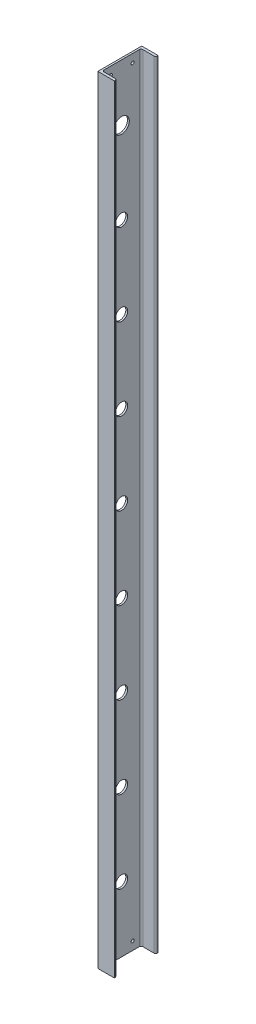
ISO-10303-21;
HEADER;
FILE_DESCRIPTION(('STEP AP214'),'2;1');
FILE_NAME('part.step','',(''),(''),'','','');
FILE_SCHEMA(('AUTOMOTIVE_DESIGN { 1 0 10303 214 1 1 1 1 }'));
ENDSEC;
DATA;
#1=APPLICATION_CONTEXT('core data for automotive mechanical design processes');
#2=APPLICATION_PROTOCOL_DEFINITION('international standard','automotive_design',2000,#1);
#3=PRODUCT_CONTEXT('',#1,'mechanical');
#4=PRODUCT('Part','Part','',(#3));
#5=PRODUCT_RELATED_PRODUCT_CATEGORY('part','',(#4));
#6=PRODUCT_DEFINITION_FORMATION('','',#4);
#7=PRODUCT_DEFINITION_CONTEXT('part definition',#1,'design');
#8=PRODUCT_DEFINITION('design','',#6,#7);
#9=PRODUCT_DEFINITION_SHAPE('','',#8);
#10=(LENGTH_UNIT() NAMED_UNIT(*) SI_UNIT(.MILLI.,.METRE.));
#11=(NAMED_UNIT(*) PLANE_ANGLE_UNIT() SI_UNIT($,.RADIAN.));
#12=(NAMED_UNIT(*) SI_UNIT($,.STERADIAN.) SOLID_ANGLE_UNIT());
#13=UNCERTAINTY_MEASURE_WITH_UNIT(LENGTH_MEASURE(1.E-05),#10,'distance_accuracy_value','');
#14=(GEOMETRIC_REPRESENTATION_CONTEXT(3) GLOBAL_UNCERTAINTY_ASSIGNED_CONTEXT((#13)) GLOBAL_UNIT_ASSIGNED_CONTEXT((#10,
#11,#12)) REPRESENTATION_CONTEXT('',''));
#15=CARTESIAN_POINT('',(0.,0.,0.));
#16=DIRECTION('',(0.,0.,1.));
#17=DIRECTION('',(1.,0.,0.));
#18=AXIS2_PLACEMENT_3D('',#15,#16,#17);
#19=CARTESIAN_POINT('',(-113.44262295082,2908.,19.0163934426229));
#20=DIRECTION('',(1.,0.,0.));
#21=DIRECTION('',(0.,0.,-1.));
#22=AXIS2_PLACEMENT_3D('',#19,#20,#21);
#23=CYLINDRICAL_SURFACE('',#22,27.5);
#24=CARTESIAN_POINT('',(-113.44262295082,2908.,19.0163934426229));
#25=DIRECTION('',(1.,0.,0.));
#26=DIRECTION('',(0.,0.,-1.));
#27=AXIS2_PLACEMENT_3D('',#24,#25,#26);
#28=CIRCLE('',#27,27.5);
#29=CARTESIAN_POINT('',(-113.44262295082,2908.,-8.48360655737707));
#30=VERTEX_POINT('',#29);
#31=EDGE_CURVE('E40',#30,#30,#28,.T.);
#32=ORIENTED_EDGE('',*,*,#31,.F.);
#33=EDGE_LOOP('',(#32));
#34=FACE_BOUND('',#33,.T.);
#35=CARTESIAN_POINT('',(-104.94262295082,2908.,19.0163934426229));
#36=DIRECTION('',(-1.,0.,0.));
#37=DIRECTION('',(0.,0.,1.));
#38=AXIS2_PLACEMENT_3D('',#35,#36,#37);
#39=CIRCLE('',#38,27.5);
#40=CARTESIAN_POINT('',(-104.94262295082,2908.,46.516393442623));
#41=VERTEX_POINT('',#40);
#42=EDGE_CURVE('E11',#41,#41,#39,.T.);
#43=ORIENTED_EDGE('',*,*,#42,.F.);
#44=EDGE_LOOP('',(#43));
#45=FACE_BOUND('',#44,.T.);
#46=ADVANCED_FACE('F32',(#34,#45),#23,.F.);
#47=CARTESIAN_POINT('',(-113.44262295082,2535.,19.0163934426229));
#48=DIRECTION('',(1.,0.,0.));
#49=DIRECTION('',(0.,0.,-1.));
#50=AXIS2_PLACEMENT_3D('',#47,#48,#49);
#51=CYLINDRICAL_SURFACE('',#50,27.5);
#52=CARTESIAN_POINT('',(-113.44262295082,2535.,19.0163934426229));
#53=DIRECTION('',(1.,0.,0.));
#54=DIRECTION('',(0.,0.,-1.));
#55=AXIS2_PLACEMENT_3D('',#52,#53,#54);
#56=CIRCLE('',#55,27.5);
#57=CARTESIAN_POINT('',(-113.44262295082,2535.,-8.48360655737707));
#58=VERTEX_POINT('',#57);
#59=EDGE_CURVE('E246',#58,#58,#56,.T.);
#60=ORIENTED_EDGE('',*,*,#59,.F.);
#61=EDGE_LOOP('',(#60));
#62=FACE_BOUND('',#61,.T.);
#63=CARTESIAN_POINT('',(-104.94262295082,2535.,19.0163934426229));
#64=DIRECTION('',(-1.,0.,0.));
#65=DIRECTION('',(0.,0.,1.));
#66=AXIS2_PLACEMENT_3D('',#63,#64,#65);
#67=CIRCLE('',#66,27.5);
#68=CARTESIAN_POINT('',(-104.94262295082,2535.,46.516393442623));
#69=VERTEX_POINT('',#68);
#70=EDGE_CURVE('E249',#69,#69,#67,.T.);
#71=ORIENTED_EDGE('',*,*,#70,.F.);
#72=EDGE_LOOP('',(#71));
#73=FACE_BOUND('',#72,.T.);
#74=ADVANCED_FACE('F258',(#62,#73),#51,.F.);
#75=CARTESIAN_POINT('',(-113.44262295082,2162.,19.0163934426229));
#76=DIRECTION('',(1.,0.,0.));
#77=DIRECTION('',(0.,0.,-1.));
#78=AXIS2_PLACEMENT_3D('',#75,#76,#77);
#79=CYLINDRICAL_SURFACE('',#78,27.5);
#80=CARTESIAN_POINT('',(-113.44262295082,2162.,19.0163934426229));
#81=DIRECTION('',(1.,0.,0.));
#82=DIRECTION('',(0.,0.,-1.));
#83=AXIS2_PLACEMENT_3D('',#80,#81,#82);
#84=CIRCLE('',#83,27.5);
#85=CARTESIAN_POINT('',(-113.44262295082,2162.,-8.48360655737707));
#86=VERTEX_POINT('',#85);
#87=EDGE_CURVE('E240',#86,#86,#84,.T.);
#88=ORIENTED_EDGE('',*,*,#87,.F.);
#89=EDGE_LOOP('',(#88));
#90=FACE_BOUND('',#89,.T.);
#91=CARTESIAN_POINT('',(-104.94262295082,2162.,19.0163934426229));
#92=DIRECTION('',(-1.,0.,0.));
#93=DIRECTION('',(0.,0.,1.));
#94=AXIS2_PLACEMENT_3D('',#91,#92,#93);
#95=CIRCLE('',#94,27.5);
#96=CARTESIAN_POINT('',(-104.94262295082,2162.,46.516393442623));
#97=VERTEX_POINT('',#96);
#98=EDGE_CURVE('E243',#97,#97,#95,.T.);
#99=ORIENTED_EDGE('',*,*,#98,.F.);
#100=EDGE_LOOP('',(#99));
#101=FACE_BOUND('',#100,.T.);
#102=ADVANCED_FACE('F314',(#90,#101),#79,.F.);
#103=CARTESIAN_POINT('',(-113.44262295082,1789.,19.0163934426229));
#104=DIRECTION('',(1.,0.,0.));
#105=DIRECTION('',(0.,0.,-1.));
#106=AXIS2_PLACEMENT_3D('',#103,#104,#105);
#107=CYLINDRICAL_SURFACE('',#106,27.5);
#108=CARTESIAN_POINT('',(-113.44262295082,1789.,19.0163934426229));
#109=DIRECTION('',(1.,0.,0.));
#110=DIRECTION('',(0.,0.,-1.));
#111=AXIS2_PLACEMENT_3D('',#108,#109,#110);
#112=CIRCLE('',#111,27.5);
#113=CARTESIAN_POINT('',(-113.44262295082,1789.,-8.48360655737707));
#114=VERTEX_POINT('',#113);
#115=EDGE_CURVE('E234',#114,#114,#112,.T.);
#116=ORIENTED_EDGE('',*,*,#115,.F.);
#117=EDGE_LOOP('',(#116));
#118=FACE_BOUND('',#117,.T.);
#119=CARTESIAN_POINT('',(-104.94262295082,1789.,19.0163934426229));
#120=DIRECTION('',(-1.,0.,0.));
#121=DIRECTION('',(0.,0.,1.));
#122=AXIS2_PLACEMENT_3D('',#119,#120,#121);
#123=CIRCLE('',#122,27.5);
#124=CARTESIAN_POINT('',(-104.94262295082,1789.,46.516393442623));
#125=VERTEX_POINT('',#124);
#126=EDGE_CURVE('E237',#125,#125,#123,.T.);
#127=ORIENTED_EDGE('',*,*,#126,.F.);
#128=EDGE_LOOP('',(#127));
#129=FACE_BOUND('',#128,.T.);
#130=ADVANCED_FACE('F310',(#118,#129),#107,.F.);
#131=CARTESIAN_POINT('',(-113.44262295082,1416.,19.0163934426229));
#132=DIRECTION('',(1.,0.,0.));
#133=DIRECTION('',(0.,0.,-1.));
#134=AXIS2_PLACEMENT_3D('',#131,#132,#133);
#135=CYLINDRICAL_SURFACE('',#134,27.5);
#136=CARTESIAN_POINT('',(-113.44262295082,1416.,19.0163934426229));
#137=DIRECTION('',(1.,0.,0.));
#138=DIRECTION('',(0.,0.,-1.));
#139=AXIS2_PLACEMENT_3D('',#136,#137,#138);
#140=CIRCLE('',#139,27.5);
#141=CARTESIAN_POINT('',(-113.44262295082,1416.,-8.48360655737707));
#142=VERTEX_POINT('',#141);
#143=EDGE_CURVE('E228',#142,#142,#140,.T.);
#144=ORIENTED_EDGE('',*,*,#143,.F.);
#145=EDGE_LOOP('',(#144));
#146=FACE_BOUND('',#145,.T.);
#147=CARTESIAN_POINT('',(-104.94262295082,1416.,19.0163934426229));
#148=DIRECTION('',(-1.,0.,0.));
#149=DIRECTION('',(0.,0.,1.));
#150=AXIS2_PLACEMENT_3D('',#147,#148,#149);
#151=CIRCLE('',#150,27.5);
#152=CARTESIAN_POINT('',(-104.94262295082,1416.,46.516393442623));
#153=VERTEX_POINT('',#152);
#154=EDGE_CURVE('E231',#153,#153,#151,.T.);
#155=ORIENTED_EDGE('',*,*,#154,.F.);
#156=EDGE_LOOP('',(#155));
#157=FACE_BOUND('',#156,.T.);
#158=ADVANCED_FACE('F306',(#146,#157),#135,.F.);
#159=CARTESIAN_POINT('',(-113.44262295082,1043.,19.0163934426229));
#160=DIRECTION('',(1.,0.,0.));
#161=DIRECTION('',(0.,0.,-1.));
#162=AXIS2_PLACEMENT_3D('',#159,#160,#161);
#163=CYLINDRICAL_SURFACE('',#162,27.5);
#164=CARTESIAN_POINT('',(-113.44262295082,1043.,19.0163934426229));
#165=DIRECTION('',(1.,0.,0.));
#166=DIRECTION('',(0.,0.,-1.));
#167=AXIS2_PLACEMENT_3D('',#164,#165,#166);
#168=CIRCLE('',#167,27.5);
#169=CARTESIAN_POINT('',(-113.44262295082,1043.,-8.48360655737707));
#170=VERTEX_POINT('',#169);
#171=EDGE_CURVE('E203',#170,#170,#168,.T.);
#172=ORIENTED_EDGE('',*,*,#171,.F.);
#173=EDGE_LOOP('',(#172));
#174=FACE_BOUND('',#173,.T.);
#175=CARTESIAN_POINT('',(-104.94262295082,1043.,19.0163934426229));
#176=DIRECTION('',(-1.,0.,0.));
#177=DIRECTION('',(0.,0.,1.));
#178=AXIS2_PLACEMENT_3D('',#175,#176,#177);
#179=CIRCLE('',#178,27.5);
#180=CARTESIAN_POINT('',(-104.94262295082,1043.,46.516393442623));
#181=VERTEX_POINT('',#180);
#182=EDGE_CURVE('E225',#181,#181,#179,.T.);
#183=ORIENTED_EDGE('',*,*,#182,.F.);
#184=EDGE_LOOP('',(#183));
#185=FACE_BOUND('',#184,.T.);
#186=ADVANCED_FACE('F302',(#174,#185),#163,.F.);
#187=CARTESIAN_POINT('',(-38.4426229508197,3540.,-80.9836065573771));
#188=DIRECTION('',(-1.,0.,0.));
#189=DIRECTION('',(0.,0.,1.));
#190=AXIS2_PLACEMENT_3D('',#187,#188,#189);
#191=PLANE('',#190);
#192=DIRECTION('',(0.,0.,-1.));
#193=VECTOR('',#192,1.);
#194=CARTESIAN_POINT('',(-38.4426229508197,0.,-80.9836065573771));
#195=LINE('',#194,#193);
#196=CARTESIAN_POINT('',(-38.4426229508197,0.,-77.4836065573772));
#197=VERTEX_POINT('',#196);
#198=CARTESIAN_POINT('',(-38.4426229508197,0.,-80.9836065573771));
#199=VERTEX_POINT('',#198);
#200=EDGE_CURVE('E153',#197,#199,#195,.T.);
#201=ORIENTED_EDGE('',*,*,#200,.T.);
#202=DIRECTION('',(0.,-1.,0.));
#203=VECTOR('',#202,1.);
#204=CARTESIAN_POINT('',(-38.4426229508197,3540.,-80.9836065573771));
#205=LINE('',#204,#203);
#206=CARTESIAN_POINT('',(-38.4426229508197,3540.,-80.9836065573771));
#207=VERTEX_POINT('',#206);
#208=EDGE_CURVE('E201',#207,#199,#205,.T.);
#209=ORIENTED_EDGE('',*,*,#208,.F.);
#210=DIRECTION('',(0.,0.,-1.));
#211=VECTOR('',#210,1.);
#212=CARTESIAN_POINT('',(-38.4426229508197,3540.,-80.9836065573771));
#213=LINE('',#212,#211);
#214=CARTESIAN_POINT('',(-38.4426229508197,3540.,-77.4836065573772));
#215=VERTEX_POINT('',#214);
#216=EDGE_CURVE('E176',#215,#207,#213,.T.);
#217=ORIENTED_EDGE('',*,*,#216,.F.);
#218=DIRECTION('',(0.,-1.,0.));
#219=VECTOR('',#218,1.);
#220=CARTESIAN_POINT('',(-38.4426229508197,3540.,-77.4836065573772));
#221=LINE('',#220,#219);
#222=EDGE_CURVE('E149',#215,#197,#221,.T.);
#223=ORIENTED_EDGE('',*,*,#222,.T.);
#224=EDGE_LOOP('',(#201,#209,#217,#223));
#225=FACE_BOUND('',#224,.T.);
#226=ADVANCED_FACE('F299',(#225),#191,.F.);
#227=CARTESIAN_POINT('',(-38.4426229508197,3540.,-80.9836065573771));
#228=DIRECTION('',(0.,0.,1.));
#229=DIRECTION('',(1.,0.,0.));
#230=AXIS2_PLACEMENT_3D('',#227,#228,#229);
#231=PLANE('',#230);
#232=DIRECTION('',(-1.,0.,0.));
#233=VECTOR('',#232,1.);
#234=CARTESIAN_POINT('',(-38.4426229508197,0.,-80.9836065573771));
#235=LINE('',#234,#233);
#236=CARTESIAN_POINT('',(-113.44262295082,0.,-80.983606557377));
#237=VERTEX_POINT('',#236);
#238=EDGE_CURVE('E156',#199,#237,#235,.T.);
#239=ORIENTED_EDGE('',*,*,#238,.T.);
#240=DIRECTION('',(0.,-1.,0.));
#241=VECTOR('',#240,1.);
#242=CARTESIAN_POINT('',(-113.44262295082,3540.,-80.983606557377));
#243=LINE('',#242,#241);
#244=CARTESIAN_POINT('',(-113.44262295082,3540.,-80.983606557377));
#245=VERTEX_POINT('',#244);
#246=EDGE_CURVE('E198',#245,#237,#243,.T.);
#247=ORIENTED_EDGE('',*,*,#246,.F.);
#248=DIRECTION('',(-1.,0.,0.));
#249=VECTOR('',#248,1.);
#250=CARTESIAN_POINT('',(-38.4426229508197,3540.,-80.9836065573771));
#251=LINE('',#250,#249);
#252=EDGE_CURVE('E104',#207,#245,#251,.T.);
#253=ORIENTED_EDGE('',*,*,#252,.F.);
#254=ORIENTED_EDGE('',*,*,#208,.T.);
#255=EDGE_LOOP('',(#239,#247,#253,#254));
#256=FACE_BOUND('',#255,.T.);
#257=ADVANCED_FACE('F295',(#256),#231,.F.);
#258=CARTESIAN_POINT('',(-113.44262295082,3540.,-80.983606557377));
#259=DIRECTION('',(1.,0.,0.));
#260=DIRECTION('',(0.,0.,-1.));
#261=AXIS2_PLACEMENT_3D('',#258,#259,#260);
#262=PLANE('',#261);
#263=CARTESIAN_POINT('',(-113.44262295082,3281.,19.0163934426229));
#264=DIRECTION('',(1.,0.,0.));
#265=DIRECTION('',(0.,0.,-1.));
#266=AXIS2_PLACEMENT_3D('',#263,#264,#265);
#267=CIRCLE('',#266,34.9999999999999);
#268=CARTESIAN_POINT('',(-113.44262295082,3281.,-15.983606557377));
#269=VERTEX_POINT('',#268);
#270=EDGE_CURVE('E514',#269,#269,#267,.T.);
#271=ORIENTED_EDGE('',*,*,#270,.T.);
#272=EDGE_LOOP('',(#271));
#273=FACE_BOUND('',#272,.T.);
#274=CARTESIAN_POINT('',(-113.44262295082,670.,19.0163934426229));
#275=DIRECTION('',(1.,0.,0.));
#276=DIRECTION('',(0.,0.,-1.));
#277=AXIS2_PLACEMENT_3D('',#274,#275,#276);
#278=CIRCLE('',#277,27.5);
#279=CARTESIAN_POINT('',(-113.44262295082,670.,-8.48360655737707));
#280=VERTEX_POINT('',#279);
#281=EDGE_CURVE('E515',#280,#280,#278,.T.);
#282=ORIENTED_EDGE('',*,*,#281,.T.);
#283=EDGE_LOOP('',(#282));
#284=FACE_BOUND('',#283,.T.);
#285=CARTESIAN_POINT('',(-113.44262295082,297.,19.0163934426229));
#286=DIRECTION('',(1.,0.,0.));
#287=DIRECTION('',(0.,0.,-1.));
#288=AXIS2_PLACEMENT_3D('',#285,#286,#287);
#289=CIRCLE('',#288,27.5);
#290=CARTESIAN_POINT('',(-113.44262295082,297.,-8.48360655737707));
#291=VERTEX_POINT('',#290);
#292=EDGE_CURVE('E222',#291,#291,#289,.T.);
#293=ORIENTED_EDGE('',*,*,#292,.T.);
#294=EDGE_LOOP('',(#293));
#295=FACE_BOUND('',#294,.T.);
#296=CARTESIAN_POINT('',(-113.44262295082,3502.5,-30.983606557377));
#297=DIRECTION('',(1.,0.,0.));
#298=DIRECTION('',(0.,0.,1.));
#299=AXIS2_PLACEMENT_3D('',#296,#297,#298);
#300=CIRCLE('',#299,7.);
#301=CARTESIAN_POINT('',(-113.44262295082,3502.5,-23.983606557377));
#302=VERTEX_POINT('',#301);
#303=EDGE_CURVE('E214',#302,#302,#300,.T.);
#304=ORIENTED_EDGE('',*,*,#303,.T.);
#305=EDGE_LOOP('',(#304));
#306=FACE_BOUND('',#305,.T.);
#307=CARTESIAN_POINT('',(-113.44262295082,3502.5,69.016393442623));
#308=DIRECTION('',(1.,0.,0.));
#309=DIRECTION('',(0.,0.,1.));
#310=AXIS2_PLACEMENT_3D('',#307,#308,#309);
#311=CIRCLE('',#310,7.5);
#312=CARTESIAN_POINT('',(-113.44262295082,3502.5,76.516393442623));
#313=VERTEX_POINT('',#312);
#314=EDGE_CURVE('E221',#313,#313,#311,.T.);
#315=ORIENTED_EDGE('',*,*,#314,.T.);
#316=EDGE_LOOP('',(#315));
#317=FACE_BOUND('',#316,.T.);
#318=CARTESIAN_POINT('',(-113.44262295082,37.5000000000001,-30.983606557377));
#319=DIRECTION('',(-1.,0.,0.));
#320=DIRECTION('',(0.,0.,1.));
#321=AXIS2_PLACEMENT_3D('',#318,#319,#320);
#322=CIRCLE('',#321,7.);
#323=CARTESIAN_POINT('',(-113.44262295082,37.5000000000001,-23.983606557377));
#324=VERTEX_POINT('',#323);
#325=EDGE_CURVE('E207',#324,#324,#322,.T.);
#326=ORIENTED_EDGE('',*,*,#325,.F.);
#327=EDGE_LOOP('',(#326));
#328=FACE_BOUND('',#327,.T.);
#329=CARTESIAN_POINT('',(-113.44262295082,37.5,69.016393442623));
#330=DIRECTION('',(-1.,0.,0.));
#331=DIRECTION('',(0.,0.,1.));
#332=AXIS2_PLACEMENT_3D('',#329,#330,#331);
#333=CIRCLE('',#332,7.5);
#334=CARTESIAN_POINT('',(-113.44262295082,37.5,76.516393442623));
#335=VERTEX_POINT('',#334);
#336=EDGE_CURVE('E217',#335,#335,#333,.T.);
#337=ORIENTED_EDGE('',*,*,#336,.F.);
#338=EDGE_LOOP('',(#337));
#339=FACE_BOUND('',#338,.T.);
#340=DIRECTION('',(0.,0.,1.));
#341=VECTOR('',#340,1.);
#342=CARTESIAN_POINT('',(-113.44262295082,0.,-80.983606557377));
#343=LINE('',#342,#341);
#344=CARTESIAN_POINT('',(-113.44262295082,0.,119.016393442623));
#345=VERTEX_POINT('',#344);
#346=EDGE_CURVE('E159',#237,#345,#343,.T.);
#347=ORIENTED_EDGE('',*,*,#346,.T.);
#348=DIRECTION('',(0.,-1.,0.));
#349=VECTOR('',#348,1.);
#350=CARTESIAN_POINT('',(-113.44262295082,3540.,119.016393442623));
#351=LINE('',#350,#349);
#352=CARTESIAN_POINT('',(-113.44262295082,3540.,119.016393442623));
#353=VERTEX_POINT('',#352);
#354=EDGE_CURVE('E195',#353,#345,#351,.T.);
#355=ORIENTED_EDGE('',*,*,#354,.F.);
#356=DIRECTION('',(0.,0.,1.));
#357=VECTOR('',#356,1.);
#358=CARTESIAN_POINT('',(-113.44262295082,3540.,-80.983606557377));
#359=LINE('',#358,#357);
#360=EDGE_CURVE('E536',#245,#353,#359,.T.);
#361=ORIENTED_EDGE('',*,*,#360,.F.);
#362=ORIENTED_EDGE('',*,*,#246,.T.);
#363=EDGE_LOOP('',(#347,#355,#361,#362));
#364=FACE_BOUND('',#363,.T.);
#365=ORIENTED_EDGE('',*,*,#171,.T.);
#366=EDGE_LOOP('',(#365));
#367=FACE_BOUND('',#366,.T.);
#368=ORIENTED_EDGE('',*,*,#143,.T.);
#369=EDGE_LOOP('',(#368));
#370=FACE_BOUND('',#369,.T.);
#371=ORIENTED_EDGE('',*,*,#115,.T.);
#372=EDGE_LOOP('',(#371));
#373=FACE_BOUND('',#372,.T.);
#374=ORIENTED_EDGE('',*,*,#87,.T.);
#375=EDGE_LOOP('',(#374));
#376=FACE_BOUND('',#375,.T.);
#377=ORIENTED_EDGE('',*,*,#59,.T.);
#378=EDGE_LOOP('',(#377));
#379=FACE_BOUND('',#378,.T.);
#380=ORIENTED_EDGE('',*,*,#31,.T.);
#381=EDGE_LOOP('',(#380));
#382=FACE_BOUND('',#381,.T.);
#383=ADVANCED_FACE('F254',(#273,#284,#295,#306,#317,#328,#339,#364,#367,#370,#373,#376,#379,
#382),#262,.F.);
#384=CARTESIAN_POINT('',(-113.44262295082,3540.,119.016393442623));
#385=DIRECTION('',(0.,0.,-1.));
#386=DIRECTION('',(-1.,0.,0.));
#387=AXIS2_PLACEMENT_3D('',#384,#385,#386);
#388=PLANE('',#387);
#389=DIRECTION('',(1.,0.,0.));
#390=VECTOR('',#389,1.);
#391=CARTESIAN_POINT('',(-113.44262295082,0.,119.016393442623));
#392=LINE('',#391,#390);
#393=CARTESIAN_POINT('',(-38.4426229508197,0.,119.016393442623));
#394=VERTEX_POINT('',#393);
#395=EDGE_CURVE('E161',#345,#394,#392,.T.);
#396=ORIENTED_EDGE('',*,*,#395,.T.);
#397=DIRECTION('',(0.,-1.,0.));
#398=VECTOR('',#397,1.);
#399=CARTESIAN_POINT('',(-38.4426229508197,3540.,119.016393442623));
#400=LINE('',#399,#398);
#401=CARTESIAN_POINT('',(-38.4426229508197,3540.,119.016393442623));
#402=VERTEX_POINT('',#401);
#403=EDGE_CURVE('E192',#402,#394,#400,.T.);
#404=ORIENTED_EDGE('',*,*,#403,.F.);
#405=DIRECTION('',(1.,0.,0.));
#406=VECTOR('',#405,1.);
#407=CARTESIAN_POINT('',(-113.44262295082,3540.,119.016393442623));
#408=LINE('',#407,#406);
#409=EDGE_CURVE('E538',#353,#402,#408,.T.);
#410=ORIENTED_EDGE('',*,*,#409,.F.);
#411=ORIENTED_EDGE('',*,*,#354,.T.);
#412=EDGE_LOOP('',(#396,#404,#410,#411));
#413=FACE_BOUND('',#412,.T.);
#414=ADVANCED_FACE('F288',(#413),#388,.F.);
#415=CARTESIAN_POINT('',(-38.4426229508197,3540.,119.016393442623));
#416=DIRECTION('',(-1.,0.,0.));
#417=DIRECTION('',(0.,0.,1.));
#418=AXIS2_PLACEMENT_3D('',#415,#416,#417);
#419=PLANE('',#418);
#420=DIRECTION('',(0.,0.,-1.));
#421=VECTOR('',#420,1.);
#422=CARTESIAN_POINT('',(-38.4426229508197,0.,119.016393442623));
#423=LINE('',#422,#421);
#424=CARTESIAN_POINT('',(-38.4426229508197,0.,115.516393442623));
#425=VERTEX_POINT('',#424);
#426=EDGE_CURVE('E163',#394,#425,#423,.T.);
#427=ORIENTED_EDGE('',*,*,#426,.T.);
#428=DIRECTION('',(0.,-1.,0.));
#429=VECTOR('',#428,1.);
#430=CARTESIAN_POINT('',(-38.4426229508197,3540.,115.516393442623));
#431=LINE('',#430,#429);
#432=CARTESIAN_POINT('',(-38.4426229508197,3540.,115.516393442623));
#433=VERTEX_POINT('',#432);
#434=EDGE_CURVE('E189',#433,#425,#431,.T.);
#435=ORIENTED_EDGE('',*,*,#434,.F.);
#436=DIRECTION('',(0.,0.,-1.));
#437=VECTOR('',#436,1.);
#438=CARTESIAN_POINT('',(-38.4426229508197,3540.,119.016393442623));
#439=LINE('',#438,#437);
#440=EDGE_CURVE('E540',#402,#433,#439,.T.);
#441=ORIENTED_EDGE('',*,*,#440,.F.);
#442=ORIENTED_EDGE('',*,*,#403,.T.);
#443=EDGE_LOOP('',(#427,#435,#441,#442));
#444=FACE_BOUND('',#443,.T.);
#445=ADVANCED_FACE('F284',(#444),#419,.F.);
#446=CARTESIAN_POINT('',(-46.4426229508197,3540.,115.516393442623));
#447=DIRECTION('',(0.,-1.,0.));
#448=DIRECTION('',(0.,0.,-1.));
#449=AXIS2_PLACEMENT_3D('',#446,#447,#448);
#450=CYLINDRICAL_SURFACE('',#449,8.);
#451=CARTESIAN_POINT('',(-46.4426229508197,0.,115.516393442623));
#452=DIRECTION('',(0.,1.,0.));
#453=DIRECTION('',(0.,0.,1.));
#454=AXIS2_PLACEMENT_3D('',#451,#452,#453);
#455=CIRCLE('',#454,8.);
#456=CARTESIAN_POINT('',(-46.4426229508198,0.,107.516393442623));
#457=VERTEX_POINT('',#456);
#458=EDGE_CURVE('E165',#425,#457,#455,.T.);
#459=ORIENTED_EDGE('',*,*,#458,.T.);
#460=DIRECTION('',(0.,-1.,0.));
#461=VECTOR('',#460,1.);
#462=CARTESIAN_POINT('',(-46.4426229508198,3540.,107.516393442623));
#463=LINE('',#462,#461);
#464=CARTESIAN_POINT('',(-46.4426229508198,3540.,107.516393442623));
#465=VERTEX_POINT('',#464);
#466=EDGE_CURVE('E186',#465,#457,#463,.T.);
#467=ORIENTED_EDGE('',*,*,#466,.F.);
#468=CARTESIAN_POINT('',(-46.4426229508197,3540.,115.516393442623));
#469=DIRECTION('',(0.,1.,0.));
#470=DIRECTION('',(0.,0.,1.));
#471=AXIS2_PLACEMENT_3D('',#468,#469,#470);
#472=CIRCLE('',#471,8.);
#473=EDGE_CURVE('E542',#433,#465,#472,.T.);
#474=ORIENTED_EDGE('',*,*,#473,.F.);
#475=ORIENTED_EDGE('',*,*,#434,.T.);
#476=EDGE_LOOP('',(#459,#467,#474,#475));
#477=FACE_BOUND('',#476,.T.);
#478=ADVANCED_FACE('F280',(#477),#450,.T.);
#479=CARTESIAN_POINT('',(-46.4426229508198,3540.,107.516393442623));
#480=DIRECTION('',(0.,0.,1.));
#481=DIRECTION('',(1.,0.,0.));
#482=AXIS2_PLACEMENT_3D('',#479,#480,#481);
#483=PLANE('',#482);
#484=DIRECTION('',(-1.,0.,0.));
#485=VECTOR('',#484,1.);
#486=CARTESIAN_POINT('',(-46.4426229508198,0.,107.516393442623));
#487=LINE('',#486,#485);
#488=CARTESIAN_POINT('',(-96.9426229508196,0.,107.516393442623));
#489=VERTEX_POINT('',#488);
#490=EDGE_CURVE('E167',#457,#489,#487,.T.);
#491=ORIENTED_EDGE('',*,*,#490,.T.);
#492=DIRECTION('',(0.,-1.,0.));
#493=VECTOR('',#492,1.);
#494=CARTESIAN_POINT('',(-96.9426229508196,3540.,107.516393442623));
#495=LINE('',#494,#493);
#496=CARTESIAN_POINT('',(-96.9426229508196,3540.,107.516393442623));
#497=VERTEX_POINT('',#496);
#498=EDGE_CURVE('E183',#497,#489,#495,.T.);
#499=ORIENTED_EDGE('',*,*,#498,.F.);
#500=DIRECTION('',(-1.,0.,0.));
#501=VECTOR('',#500,1.);
#502=CARTESIAN_POINT('',(-46.4426229508198,3540.,107.516393442623));
#503=LINE('',#502,#501);
#504=EDGE_CURVE('E544',#465,#497,#503,.T.);
#505=ORIENTED_EDGE('',*,*,#504,.F.);
#506=ORIENTED_EDGE('',*,*,#466,.T.);
#507=EDGE_LOOP('',(#491,#499,#505,#506));
#508=FACE_BOUND('',#507,.T.);
#509=ADVANCED_FACE('F271',(#508),#483,.F.);
#510=CARTESIAN_POINT('',(-96.9426229508197,3540.,99.516393442623));
#511=DIRECTION('',(0.,-1.,0.));
#512=DIRECTION('',(0.,0.,-1.));
#513=AXIS2_PLACEMENT_3D('',#510,#511,#512);
#514=CYLINDRICAL_SURFACE('',#513,8.00000000000001);
#515=CARTESIAN_POINT('',(-96.9426229508197,0.,99.516393442623));
#516=DIRECTION('',(0.,-1.,0.));
#517=DIRECTION('',(0.,0.,-1.));
#518=AXIS2_PLACEMENT_3D('',#515,#516,#517);
#519=CIRCLE('',#518,8.00000000000001);
#520=CARTESIAN_POINT('',(-104.94262295082,0.,99.5163934426229));
#521=VERTEX_POINT('',#520);
#522=EDGE_CURVE('E169',#489,#521,#519,.T.);
#523=ORIENTED_EDGE('',*,*,#522,.T.);
#524=DIRECTION('',(0.,-1.,0.));
#525=VECTOR('',#524,1.);
#526=CARTESIAN_POINT('',(-104.94262295082,3540.,99.5163934426229));
#527=LINE('',#526,#525);
#528=CARTESIAN_POINT('',(-104.94262295082,3540.,99.5163934426229));
#529=VERTEX_POINT('',#528);
#530=EDGE_CURVE('E180',#529,#521,#527,.T.);
#531=ORIENTED_EDGE('',*,*,#530,.F.);
#532=CARTESIAN_POINT('',(-96.9426229508197,3540.,99.516393442623));
#533=DIRECTION('',(0.,-1.,0.));
#534=DIRECTION('',(0.,0.,-1.));
#535=AXIS2_PLACEMENT_3D('',#532,#533,#534);
#536=CIRCLE('',#535,8.00000000000001);
#537=EDGE_CURVE('E546',#497,#529,#536,.T.);
#538=ORIENTED_EDGE('',*,*,#537,.F.);
#539=ORIENTED_EDGE('',*,*,#498,.T.);
#540=EDGE_LOOP('',(#523,#531,#538,#539));
#541=FACE_BOUND('',#540,.T.);
#542=ADVANCED_FACE('F263',(#541),#514,.F.);
#543=CARTESIAN_POINT('',(-104.94262295082,3540.,99.5163934426229));
#544=DIRECTION('',(-1.,0.,0.));
#545=DIRECTION('',(0.,0.,1.));
#546=AXIS2_PLACEMENT_3D('',#543,#544,#545);
#547=PLANE('',#546);
#548=CARTESIAN_POINT('',(-104.94262295082,3281.,19.0163934426229));
#549=DIRECTION('',(1.,0.,0.));
#550=DIRECTION('',(0.,0.,-1.));
#551=AXIS2_PLACEMENT_3D('',#548,#549,#550);
#552=CIRCLE('',#551,34.9999999999999);
#553=CARTESIAN_POINT('',(-104.94262295082,3281.,-15.983606557377));
#554=VERTEX_POINT('',#553);
#555=EDGE_CURVE('E511',#554,#554,#552,.T.);
#556=ORIENTED_EDGE('',*,*,#555,.F.);
#557=EDGE_LOOP('',(#556));
#558=FACE_BOUND('',#557,.T.);
#559=CARTESIAN_POINT('',(-104.94262295082,670.,19.0163934426229));
#560=DIRECTION('',(-1.,0.,0.));
#561=DIRECTION('',(0.,0.,1.));
#562=AXIS2_PLACEMENT_3D('',#559,#560,#561);
#563=CIRCLE('',#562,27.5);
#564=CARTESIAN_POINT('',(-104.94262295082,670.,46.516393442623));
#565=VERTEX_POINT('',#564);
#566=EDGE_CURVE('E518',#565,#565,#563,.T.);
#567=ORIENTED_EDGE('',*,*,#566,.T.);
#568=EDGE_LOOP('',(#567));
#569=FACE_BOUND('',#568,.T.);
#570=CARTESIAN_POINT('',(-104.94262295082,297.,19.0163934426229));
#571=DIRECTION('',(-1.,0.,0.));
#572=DIRECTION('',(0.,0.,1.));
#573=AXIS2_PLACEMENT_3D('',#570,#571,#572);
#574=CIRCLE('',#573,27.5);
#575=CARTESIAN_POINT('',(-104.94262295082,297.,46.516393442623));
#576=VERTEX_POINT('',#575);
#577=EDGE_CURVE('E218',#576,#576,#574,.T.);
#578=ORIENTED_EDGE('',*,*,#577,.T.);
#579=EDGE_LOOP('',(#578));
#580=FACE_BOUND('',#579,.T.);
#581=CARTESIAN_POINT('',(-104.94262295082,3502.5,-30.983606557377));
#582=DIRECTION('',(-1.,0.,0.));
#583=DIRECTION('',(0.,0.,1.));
#584=AXIS2_PLACEMENT_3D('',#581,#582,#583);
#585=CIRCLE('',#584,7.);
#586=CARTESIAN_POINT('',(-104.94262295082,3502.5,-23.983606557377));
#587=VERTEX_POINT('',#586);
#588=EDGE_CURVE('E213',#587,#587,#585,.F.);
#589=ORIENTED_EDGE('',*,*,#588,.F.);
#590=EDGE_LOOP('',(#589));
#591=FACE_BOUND('',#590,.T.);
#592=CARTESIAN_POINT('',(-104.94262295082,3502.5,69.016393442623));
#593=DIRECTION('',(-1.,0.,0.));
#594=DIRECTION('',(0.,0.,1.));
#595=AXIS2_PLACEMENT_3D('',#592,#593,#594);
#596=CIRCLE('',#595,7.5);
#597=CARTESIAN_POINT('',(-104.94262295082,3502.5,76.516393442623));
#598=VERTEX_POINT('',#597);
#599=EDGE_CURVE('E210',#598,#598,#596,.F.);
#600=ORIENTED_EDGE('',*,*,#599,.F.);
#601=EDGE_LOOP('',(#600));
#602=FACE_BOUND('',#601,.T.);
#603=CARTESIAN_POINT('',(-104.94262295082,37.5000000000001,-30.983606557377));
#604=DIRECTION('',(-1.,0.,0.));
#605=DIRECTION('',(0.,0.,1.));
#606=AXIS2_PLACEMENT_3D('',#603,#604,#605);
#607=CIRCLE('',#606,7.);
#608=CARTESIAN_POINT('',(-104.94262295082,37.5000000000001,-23.983606557377));
#609=VERTEX_POINT('',#608);
#610=EDGE_CURVE('E157',#609,#609,#607,.T.);
#611=ORIENTED_EDGE('',*,*,#610,.T.);
#612=EDGE_LOOP('',(#611));
#613=FACE_BOUND('',#612,.T.);
#614=CARTESIAN_POINT('',(-104.94262295082,37.5,69.016393442623));
#615=DIRECTION('',(-1.,0.,0.));
#616=DIRECTION('',(0.,0.,1.));
#617=AXIS2_PLACEMENT_3D('',#614,#615,#616);
#618=CIRCLE('',#617,7.5);
#619=CARTESIAN_POINT('',(-104.94262295082,37.5,76.516393442623));
#620=VERTEX_POINT('',#619);
#621=EDGE_CURVE('E204',#620,#620,#618,.T.);
#622=ORIENTED_EDGE('',*,*,#621,.T.);
#623=EDGE_LOOP('',(#622));
#624=FACE_BOUND('',#623,.T.);
#625=DIRECTION('',(0.,0.,-1.));
#626=VECTOR('',#625,1.);
#627=CARTESIAN_POINT('',(-104.94262295082,0.,99.5163934426229));
#628=LINE('',#627,#626);
#629=CARTESIAN_POINT('',(-104.94262295082,0.,-61.483606557377));
#630=VERTEX_POINT('',#629);
#631=EDGE_CURVE('E171',#521,#630,#628,.T.);
#632=ORIENTED_EDGE('',*,*,#631,.T.);
#633=DIRECTION('',(0.,-1.,0.));
#634=VECTOR('',#633,1.);
#635=CARTESIAN_POINT('',(-104.94262295082,3540.,-61.483606557377));
#636=LINE('',#635,#634);
#637=CARTESIAN_POINT('',(-104.94262295082,3540.,-61.483606557377));
#638=VERTEX_POINT('',#637);
#639=EDGE_CURVE('E144',#638,#630,#636,.T.);
#640=ORIENTED_EDGE('',*,*,#639,.F.);
#641=DIRECTION('',(0.,0.,-1.));
#642=VECTOR('',#641,1.);
#643=CARTESIAN_POINT('',(-104.94262295082,3540.,99.5163934426229));
#644=LINE('',#643,#642);
#645=EDGE_CURVE('E135',#529,#638,#644,.T.);
#646=ORIENTED_EDGE('',*,*,#645,.F.);
#647=ORIENTED_EDGE('',*,*,#530,.T.);
#648=EDGE_LOOP('',(#632,#640,#646,#647));
#649=FACE_BOUND('',#648,.T.);
#650=ORIENTED_EDGE('',*,*,#182,.T.);
#651=EDGE_LOOP('',(#650));
#652=FACE_BOUND('',#651,.T.);
#653=ORIENTED_EDGE('',*,*,#154,.T.);
#654=EDGE_LOOP('',(#653));
#655=FACE_BOUND('',#654,.T.);
#656=ORIENTED_EDGE('',*,*,#126,.T.);
#657=EDGE_LOOP('',(#656));
#658=FACE_BOUND('',#657,.T.);
#659=ORIENTED_EDGE('',*,*,#98,.T.);
#660=EDGE_LOOP('',(#659));
#661=FACE_BOUND('',#660,.T.);
#662=ORIENTED_EDGE('',*,*,#70,.T.);
#663=EDGE_LOOP('',(#662));
#664=FACE_BOUND('',#663,.T.);
#665=ORIENTED_EDGE('',*,*,#42,.T.);
#666=EDGE_LOOP('',(#665));
#667=FACE_BOUND('',#666,.T.);
#668=ADVANCED_FACE('F261',(#558,#569,#580,#591,#602,#613,#624,#649,#652,#655,#658,#661,#664,
#667),#547,.F.);
#669=CARTESIAN_POINT('',(-96.9426229508197,3540.,-61.4836065573771));
#670=DIRECTION('',(0.,-1.,0.));
#671=DIRECTION('',(0.,0.,-1.));
#672=AXIS2_PLACEMENT_3D('',#669,#670,#671);
#673=CYLINDRICAL_SURFACE('',#672,8.);
#674=CARTESIAN_POINT('',(-96.9426229508197,0.,-61.4836065573771));
#675=DIRECTION('',(0.,-1.,0.));
#676=DIRECTION('',(0.,0.,-1.));
#677=AXIS2_PLACEMENT_3D('',#674,#675,#676);
#678=CIRCLE('',#677,8.);
#679=CARTESIAN_POINT('',(-96.9426229508197,0.,-69.4836065573771));
#680=VERTEX_POINT('',#679);
#681=EDGE_CURVE('E143',#630,#680,#678,.T.);
#682=ORIENTED_EDGE('',*,*,#681,.T.);
#683=DIRECTION('',(0.,-1.,0.));
#684=VECTOR('',#683,1.);
#685=CARTESIAN_POINT('',(-96.9426229508197,3540.,-69.4836065573771));
#686=LINE('',#685,#684);
#687=CARTESIAN_POINT('',(-96.9426229508197,3540.,-69.4836065573771));
#688=VERTEX_POINT('',#687);
#689=EDGE_CURVE('E140',#688,#680,#686,.T.);
#690=ORIENTED_EDGE('',*,*,#689,.F.);
#691=CARTESIAN_POINT('',(-96.9426229508197,3540.,-61.4836065573771));
#692=DIRECTION('',(0.,-1.,0.));
#693=DIRECTION('',(0.,0.,-1.));
#694=AXIS2_PLACEMENT_3D('',#691,#692,#693);
#695=CIRCLE('',#694,8.);
#696=EDGE_CURVE('E129',#638,#688,#695,.T.);
#697=ORIENTED_EDGE('',*,*,#696,.F.);
#698=ORIENTED_EDGE('',*,*,#639,.T.);
#699=EDGE_LOOP('',(#682,#690,#697,#698));
#700=FACE_BOUND('',#699,.T.);
#701=ADVANCED_FACE('F141',(#700),#673,.F.);
#702=CARTESIAN_POINT('',(-96.9426229508196,3540.,-69.4836065573771));
#703=DIRECTION('',(0.,0.,-1.));
#704=DIRECTION('',(-1.,0.,0.));
#705=AXIS2_PLACEMENT_3D('',#702,#703,#704);
#706=PLANE('',#705);
#707=DIRECTION('',(1.,0.,0.));
#708=VECTOR('',#707,1.);
#709=CARTESIAN_POINT('',(-96.9426229508196,0.,-69.4836065573771));
#710=LINE('',#709,#708);
#711=CARTESIAN_POINT('',(-46.4426229508198,0.,-69.4836065573771));
#712=VERTEX_POINT('',#711);
#713=EDGE_CURVE('E89',#680,#712,#710,.T.);
#714=ORIENTED_EDGE('',*,*,#713,.T.);
#715=DIRECTION('',(0.,-1.,0.));
#716=VECTOR('',#715,1.);
#717=CARTESIAN_POINT('',(-46.4426229508198,3540.,-69.4836065573771));
#718=LINE('',#717,#716);
#719=CARTESIAN_POINT('',(-46.4426229508198,3540.,-69.4836065573771));
#720=VERTEX_POINT('',#719);
#721=EDGE_CURVE('E145',#720,#712,#718,.T.);
#722=ORIENTED_EDGE('',*,*,#721,.F.);
#723=DIRECTION('',(1.,0.,0.));
#724=VECTOR('',#723,1.);
#725=CARTESIAN_POINT('',(-96.9426229508196,3540.,-69.4836065573771));
#726=LINE('',#725,#724);
#727=EDGE_CURVE('E133',#688,#720,#726,.T.);
#728=ORIENTED_EDGE('',*,*,#727,.F.);
#729=ORIENTED_EDGE('',*,*,#689,.T.);
#730=EDGE_LOOP('',(#714,#722,#728,#729));
#731=FACE_BOUND('',#730,.T.);
#732=ADVANCED_FACE('F147',(#731),#706,.F.);
#733=CARTESIAN_POINT('',(-46.4426229508197,3540.,-77.4836065573771));
#734=DIRECTION('',(0.,-1.,0.));
#735=DIRECTION('',(0.,0.,-1.));
#736=AXIS2_PLACEMENT_3D('',#733,#734,#735);
#737=CYLINDRICAL_SURFACE('',#736,8.);
#738=CARTESIAN_POINT('',(-46.4426229508197,0.,-77.4836065573771));
#739=DIRECTION('',(0.,1.,0.));
#740=DIRECTION('',(0.,0.,1.));
#741=AXIS2_PLACEMENT_3D('',#738,#739,#740);
#742=CIRCLE('',#741,8.);
#743=EDGE_CURVE('E95',#712,#197,#742,.T.);
#744=ORIENTED_EDGE('',*,*,#743,.T.);
#745=ORIENTED_EDGE('',*,*,#222,.F.);
#746=CARTESIAN_POINT('',(-46.4426229508197,3540.,-77.4836065573771));
#747=DIRECTION('',(0.,1.,0.));
#748=DIRECTION('',(0.,0.,1.));
#749=AXIS2_PLACEMENT_3D('',#746,#747,#748);
#750=CIRCLE('',#749,8.);
#751=EDGE_CURVE('E48',#720,#215,#750,.T.);
#752=ORIENTED_EDGE('',*,*,#751,.F.);
#753=ORIENTED_EDGE('',*,*,#721,.T.);
#754=EDGE_LOOP('',(#744,#745,#752,#753));
#755=FACE_BOUND('',#754,.T.);
#756=ADVANCED_FACE('F394',(#755),#737,.T.);
#757=CARTESIAN_POINT('',(-46.4426229508197,3540.,-77.4836065573771));
#758=DIRECTION('',(0.,1.,0.));
#759=DIRECTION('',(0.,0.,1.));
#760=AXIS2_PLACEMENT_3D('',#757,#758,#759);
#761=PLANE('',#760);
#762=ORIENTED_EDGE('',*,*,#216,.T.);
#763=ORIENTED_EDGE('',*,*,#252,.T.);
#764=ORIENTED_EDGE('',*,*,#360,.T.);
#765=ORIENTED_EDGE('',*,*,#409,.T.);
#766=ORIENTED_EDGE('',*,*,#440,.T.);
#767=ORIENTED_EDGE('',*,*,#473,.T.);
#768=ORIENTED_EDGE('',*,*,#504,.T.);
#769=ORIENTED_EDGE('',*,*,#537,.T.);
#770=ORIENTED_EDGE('',*,*,#645,.T.);
#771=ORIENTED_EDGE('',*,*,#696,.T.);
#772=ORIENTED_EDGE('',*,*,#727,.T.);
#773=ORIENTED_EDGE('',*,*,#751,.T.);
#774=EDGE_LOOP('',(#762,#763,#764,#765,#766,#767,#768,#769,#770,#771,#772,#773));
#775=FACE_BOUND('',#774,.T.);
#776=ADVANCED_FACE('F131',(#775),#761,.T.);
#777=CARTESIAN_POINT('',(-46.4426229508197,0.,-77.4836065573771));
#778=DIRECTION('',(0.,1.,0.));
#779=DIRECTION('',(0.,0.,1.));
#780=AXIS2_PLACEMENT_3D('',#777,#778,#779);
#781=PLANE('',#780);
#782=ORIENTED_EDGE('',*,*,#200,.F.);
#783=ORIENTED_EDGE('',*,*,#743,.F.);
#784=ORIENTED_EDGE('',*,*,#713,.F.);
#785=ORIENTED_EDGE('',*,*,#681,.F.);
#786=ORIENTED_EDGE('',*,*,#631,.F.);
#787=ORIENTED_EDGE('',*,*,#522,.F.);
#788=ORIENTED_EDGE('',*,*,#490,.F.);
#789=ORIENTED_EDGE('',*,*,#458,.F.);
#790=ORIENTED_EDGE('',*,*,#426,.F.);
#791=ORIENTED_EDGE('',*,*,#395,.F.);
#792=ORIENTED_EDGE('',*,*,#346,.F.);
#793=ORIENTED_EDGE('',*,*,#238,.F.);
#794=EDGE_LOOP('',(#782,#783,#784,#785,#786,#787,#788,#789,#790,#791,#792,#793));
#795=FACE_BOUND('',#794,.T.);
#796=ADVANCED_FACE('F410',(#795),#781,.F.);
#797=CARTESIAN_POINT('',(3426.55737704918,37.5,69.0163934426225));
#798=DIRECTION('',(-1.,0.,0.));
#799=DIRECTION('',(0.,0.,1.));
#800=AXIS2_PLACEMENT_3D('',#797,#798,#799);
#801=CYLINDRICAL_SURFACE('',#800,7.5);
#802=ORIENTED_EDGE('',*,*,#336,.T.);
#803=EDGE_LOOP('',(#802));
#804=FACE_BOUND('',#803,.T.);
#805=ORIENTED_EDGE('',*,*,#621,.F.);
#806=EDGE_LOOP('',(#805));
#807=FACE_BOUND('',#806,.T.);
#808=ADVANCED_FACE('F419',(#804,#807),#801,.F.);
#809=CARTESIAN_POINT('',(3426.55737704918,37.5000000000001,-30.9836065573775));
#810=DIRECTION('',(-1.,0.,0.));
#811=DIRECTION('',(0.,0.,1.));
#812=AXIS2_PLACEMENT_3D('',#809,#810,#811);
#813=CYLINDRICAL_SURFACE('',#812,7.);
#814=ORIENTED_EDGE('',*,*,#325,.T.);
#815=EDGE_LOOP('',(#814));
#816=FACE_BOUND('',#815,.T.);
#817=ORIENTED_EDGE('',*,*,#610,.F.);
#818=EDGE_LOOP('',(#817));
#819=FACE_BOUND('',#818,.T.);
#820=ADVANCED_FACE('F429',(#816,#819),#813,.F.);
#821=CARTESIAN_POINT('',(3426.55737704918,3502.5,69.0163934426225));
#822=DIRECTION('',(-1.,0.,0.));
#823=DIRECTION('',(0.,0.,1.));
#824=AXIS2_PLACEMENT_3D('',#821,#822,#823);
#825=CYLINDRICAL_SURFACE('',#824,7.5);
#826=ORIENTED_EDGE('',*,*,#314,.F.);
#827=EDGE_LOOP('',(#826));
#828=FACE_BOUND('',#827,.T.);
#829=ORIENTED_EDGE('',*,*,#599,.T.);
#830=EDGE_LOOP('',(#829));
#831=FACE_BOUND('',#830,.T.);
#832=ADVANCED_FACE('F439',(#828,#831),#825,.F.);
#833=CARTESIAN_POINT('',(3426.55737704918,3502.5,-30.9836065573775));
#834=DIRECTION('',(-1.,0.,0.));
#835=DIRECTION('',(0.,0.,1.));
#836=AXIS2_PLACEMENT_3D('',#833,#834,#835);
#837=CYLINDRICAL_SURFACE('',#836,7.);
#838=ORIENTED_EDGE('',*,*,#303,.F.);
#839=EDGE_LOOP('',(#838));
#840=FACE_BOUND('',#839,.T.);
#841=ORIENTED_EDGE('',*,*,#588,.T.);
#842=EDGE_LOOP('',(#841));
#843=FACE_BOUND('',#842,.T.);
#844=ADVANCED_FACE('F449',(#840,#843),#837,.F.);
#845=CARTESIAN_POINT('',(-113.44262295082,297.,19.0163934426229));
#846=DIRECTION('',(1.,0.,0.));
#847=DIRECTION('',(0.,0.,-1.));
#848=AXIS2_PLACEMENT_3D('',#845,#846,#847);
#849=CYLINDRICAL_SURFACE('',#848,27.5);
#850=ORIENTED_EDGE('',*,*,#292,.F.);
#851=EDGE_LOOP('',(#850));
#852=FACE_BOUND('',#851,.T.);
#853=ORIENTED_EDGE('',*,*,#577,.F.);
#854=EDGE_LOOP('',(#853));
#855=FACE_BOUND('',#854,.T.);
#856=ADVANCED_FACE('F459',(#852,#855),#849,.F.);
#857=CARTESIAN_POINT('',(-113.44262295082,670.,19.0163934426229));
#858=DIRECTION('',(1.,0.,0.));
#859=DIRECTION('',(0.,0.,-1.));
#860=AXIS2_PLACEMENT_3D('',#857,#858,#859);
#861=CYLINDRICAL_SURFACE('',#860,27.5);
#862=ORIENTED_EDGE('',*,*,#281,.F.);
#863=EDGE_LOOP('',(#862));
#864=FACE_BOUND('',#863,.T.);
#865=ORIENTED_EDGE('',*,*,#566,.F.);
#866=EDGE_LOOP('',(#865));
#867=FACE_BOUND('',#866,.T.);
#868=ADVANCED_FACE('F468',(#864,#867),#861,.F.);
#869=CARTESIAN_POINT('',(-124.94262295082,3281.,19.0163934426229));
#870=DIRECTION('',(1.,0.,0.));
#871=DIRECTION('',(0.,0.,-1.));
#872=AXIS2_PLACEMENT_3D('',#869,#870,#871);
#873=CYLINDRICAL_SURFACE('',#872,34.9999999999999);
#874=ORIENTED_EDGE('',*,*,#555,.T.);
#875=EDGE_LOOP('',(#874));
#876=FACE_BOUND('',#875,.T.);
#877=ORIENTED_EDGE('',*,*,#270,.F.);
#878=EDGE_LOOP('',(#877));
#879=FACE_BOUND('',#878,.T.);
#880=ADVANCED_FACE('F493',(#876,#879),#873,.F.);
#881=CLOSED_SHELL('',(#46,#74,#102,#130,#158,#186,#226,#257,#383,#414,#445,#478,#509,#542,#668,
#701,#732,#756,#776,#796,#808,#820,#832,#844,#856,#868,#880));
#882=MANIFOLD_SOLID_BREP('B2',#881);
#883=ADVANCED_BREP_SHAPE_REPRESENTATION('',(#18,#882),#14);
#884=SHAPE_DEFINITION_REPRESENTATION(#9,#883);
ENDSEC;
END-ISO-10303-21;
